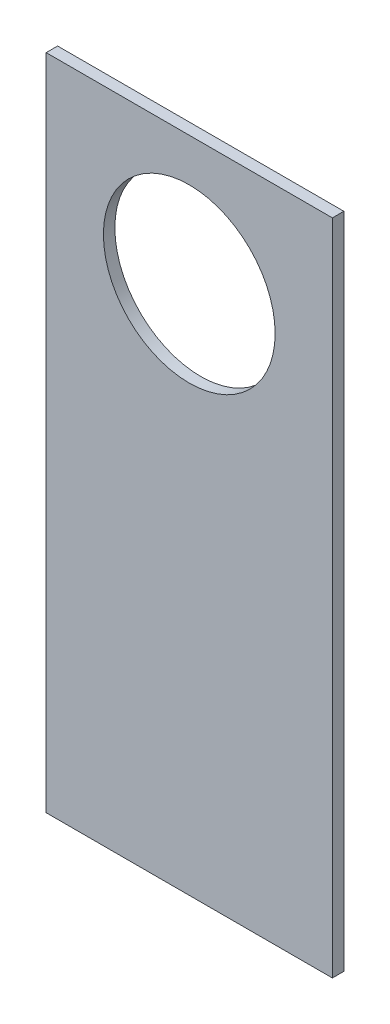
ISO-10303-21;
HEADER;
FILE_DESCRIPTION(('STEP AP214'),'2;1');
FILE_NAME('part.step','',(''),(''),'','','');
FILE_SCHEMA(('AUTOMOTIVE_DESIGN { 1 0 10303 214 1 1 1 1 }'));
ENDSEC;
DATA;
#1=APPLICATION_CONTEXT('core data for automotive mechanical design processes');
#2=APPLICATION_PROTOCOL_DEFINITION('international standard','automotive_design',2000,#1);
#3=PRODUCT_CONTEXT('',#1,'mechanical');
#4=PRODUCT('Part','Part','',(#3));
#5=PRODUCT_RELATED_PRODUCT_CATEGORY('part','',(#4));
#6=PRODUCT_DEFINITION_FORMATION('','',#4);
#7=PRODUCT_DEFINITION_CONTEXT('part definition',#1,'design');
#8=PRODUCT_DEFINITION('design','',#6,#7);
#9=PRODUCT_DEFINITION_SHAPE('','',#8);
#10=(LENGTH_UNIT() NAMED_UNIT(*) SI_UNIT(.MILLI.,.METRE.));
#11=(NAMED_UNIT(*) PLANE_ANGLE_UNIT() SI_UNIT($,.RADIAN.));
#12=(NAMED_UNIT(*) SI_UNIT($,.STERADIAN.) SOLID_ANGLE_UNIT());
#13=UNCERTAINTY_MEASURE_WITH_UNIT(LENGTH_MEASURE(1.E-05),#10,'distance_accuracy_value','');
#14=(GEOMETRIC_REPRESENTATION_CONTEXT(3) GLOBAL_UNCERTAINTY_ASSIGNED_CONTEXT((#13)) GLOBAL_UNIT_ASSIGNED_CONTEXT((#10,
#11,#12)) REPRESENTATION_CONTEXT('',''));
#15=CARTESIAN_POINT('',(0.,0.,0.));
#16=DIRECTION('',(0.,0.,1.));
#17=DIRECTION('',(1.,0.,0.));
#18=AXIS2_PLACEMENT_3D('',#15,#16,#17);
#19=CARTESIAN_POINT('',(-100.,460.,8.));
#20=DIRECTION('',(0.,-1.,0.));
#21=DIRECTION('',(0.,0.,-1.));
#22=AXIS2_PLACEMENT_3D('',#19,#20,#21);
#23=PLANE('',#22);
#24=DIRECTION('',(-1.,0.,0.));
#25=VECTOR('',#24,1.);
#26=CARTESIAN_POINT('',(-100.,460.,0.));
#27=LINE('',#26,#25);
#28=CARTESIAN_POINT('',(100.,460.,0.));
#29=VERTEX_POINT('',#28);
#30=CARTESIAN_POINT('',(-100.,460.,0.));
#31=VERTEX_POINT('',#30);
#32=EDGE_CURVE('E98',#29,#31,#27,.T.);
#33=ORIENTED_EDGE('',*,*,#32,.T.);
#34=DIRECTION('',(0.,0.,-1.));
#35=VECTOR('',#34,1.);
#36=CARTESIAN_POINT('',(-100.,460.,8.));
#37=LINE('',#36,#35);
#38=CARTESIAN_POINT('',(-100.,460.,8.));
#39=VERTEX_POINT('',#38);
#40=EDGE_CURVE('E11',#39,#31,#37,.T.);
#41=ORIENTED_EDGE('',*,*,#40,.F.);
#42=DIRECTION('',(-1.,0.,0.));
#43=VECTOR('',#42,1.);
#44=CARTESIAN_POINT('',(-100.,460.,8.));
#45=LINE('',#44,#43);
#46=CARTESIAN_POINT('',(100.,460.,8.));
#47=VERTEX_POINT('',#46);
#48=EDGE_CURVE('E86',#47,#39,#45,.T.);
#49=ORIENTED_EDGE('',*,*,#48,.F.);
#50=DIRECTION('',(0.,0.,-1.));
#51=VECTOR('',#50,1.);
#52=CARTESIAN_POINT('',(100.,460.,8.));
#53=LINE('',#52,#51);
#54=EDGE_CURVE('E94',#47,#29,#53,.T.);
#55=ORIENTED_EDGE('',*,*,#54,.T.);
#56=EDGE_LOOP('',(#33,#41,#49,#55));
#57=FACE_BOUND('',#56,.T.);
#58=ADVANCED_FACE('F35',(#57),#23,.F.);
#59=CARTESIAN_POINT('',(-100.,0.,8.));
#60=DIRECTION('',(1.,0.,0.));
#61=DIRECTION('',(0.,0.,-1.));
#62=AXIS2_PLACEMENT_3D('',#59,#60,#61);
#63=PLANE('',#62);
#64=DIRECTION('',(0.,-1.,0.));
#65=VECTOR('',#64,1.);
#66=CARTESIAN_POINT('',(-100.,0.,0.));
#67=LINE('',#66,#65);
#68=CARTESIAN_POINT('',(-100.,0.,0.));
#69=VERTEX_POINT('',#68);
#70=EDGE_CURVE('E90',#31,#69,#67,.T.);
#71=ORIENTED_EDGE('',*,*,#70,.T.);
#72=DIRECTION('',(0.,0.,-1.));
#73=VECTOR('',#72,1.);
#74=CARTESIAN_POINT('',(-100.,0.,8.));
#75=LINE('',#74,#73);
#76=CARTESIAN_POINT('',(-100.,0.,8.));
#77=VERTEX_POINT('',#76);
#78=EDGE_CURVE('E43',#77,#69,#75,.T.);
#79=ORIENTED_EDGE('',*,*,#78,.F.);
#80=DIRECTION('',(0.,-1.,0.));
#81=VECTOR('',#80,1.);
#82=CARTESIAN_POINT('',(-100.,0.,8.));
#83=LINE('',#82,#81);
#84=EDGE_CURVE('E81',#39,#77,#83,.T.);
#85=ORIENTED_EDGE('',*,*,#84,.F.);
#86=ORIENTED_EDGE('',*,*,#40,.T.);
#87=EDGE_LOOP('',(#71,#79,#85,#86));
#88=FACE_BOUND('',#87,.T.);
#89=ADVANCED_FACE('F89',(#88),#63,.F.);
#90=CARTESIAN_POINT('',(100.,0.,8.));
#91=DIRECTION('',(0.,1.,0.));
#92=DIRECTION('',(0.,0.,1.));
#93=AXIS2_PLACEMENT_3D('',#90,#91,#92);
#94=PLANE('',#93);
#95=DIRECTION('',(1.,0.,0.));
#96=VECTOR('',#95,1.);
#97=CARTESIAN_POINT('',(100.,0.,0.));
#98=LINE('',#97,#96);
#99=CARTESIAN_POINT('',(100.,0.,0.));
#100=VERTEX_POINT('',#99);
#101=EDGE_CURVE('E68',#69,#100,#98,.T.);
#102=ORIENTED_EDGE('',*,*,#101,.T.);
#103=DIRECTION('',(0.,0.,-1.));
#104=VECTOR('',#103,1.);
#105=CARTESIAN_POINT('',(100.,0.,8.));
#106=LINE('',#105,#104);
#107=CARTESIAN_POINT('',(100.,0.,8.));
#108=VERTEX_POINT('',#107);
#109=EDGE_CURVE('E91',#108,#100,#106,.T.);
#110=ORIENTED_EDGE('',*,*,#109,.F.);
#111=DIRECTION('',(1.,0.,0.));
#112=VECTOR('',#111,1.);
#113=CARTESIAN_POINT('',(100.,0.,8.));
#114=LINE('',#113,#112);
#115=EDGE_CURVE('E84',#77,#108,#114,.T.);
#116=ORIENTED_EDGE('',*,*,#115,.F.);
#117=ORIENTED_EDGE('',*,*,#78,.T.);
#118=EDGE_LOOP('',(#102,#110,#116,#117));
#119=FACE_BOUND('',#118,.T.);
#120=ADVANCED_FACE('F92',(#119),#94,.F.);
#121=CARTESIAN_POINT('',(100.,0.,8.));
#122=DIRECTION('',(-1.,0.,0.));
#123=DIRECTION('',(0.,0.,1.));
#124=AXIS2_PLACEMENT_3D('',#121,#122,#123);
#125=PLANE('',#124);
#126=DIRECTION('',(0.,1.,0.));
#127=VECTOR('',#126,1.);
#128=CARTESIAN_POINT('',(100.,0.,0.));
#129=LINE('',#128,#127);
#130=EDGE_CURVE('E74',#100,#29,#129,.T.);
#131=ORIENTED_EDGE('',*,*,#130,.T.);
#132=ORIENTED_EDGE('',*,*,#54,.F.);
#133=DIRECTION('',(0.,1.,0.));
#134=VECTOR('',#133,1.);
#135=CARTESIAN_POINT('',(100.,0.,8.));
#136=LINE('',#135,#134);
#137=EDGE_CURVE('E51',#108,#47,#136,.T.);
#138=ORIENTED_EDGE('',*,*,#137,.F.);
#139=ORIENTED_EDGE('',*,*,#109,.T.);
#140=EDGE_LOOP('',(#131,#132,#138,#139));
#141=FACE_BOUND('',#140,.T.);
#142=ADVANCED_FACE('F106',(#141),#125,.F.);
#143=CARTESIAN_POINT('',(0.,0.,8.));
#144=DIRECTION('',(0.,0.,1.));
#145=DIRECTION('',(1.,0.,0.));
#146=AXIS2_PLACEMENT_3D('',#143,#144,#145);
#147=PLANE('',#146);
#148=CARTESIAN_POINT('',(0.,370.,8.));
#149=DIRECTION('',(0.,0.,1.));
#150=DIRECTION('',(1.,0.,0.));
#151=AXIS2_PLACEMENT_3D('',#148,#149,#150);
#152=CIRCLE('',#151,60.);
#153=CARTESIAN_POINT('',(60.,370.,8.));
#154=VERTEX_POINT('',#153);
#155=EDGE_CURVE('E101',#154,#154,#152,.T.);
#156=ORIENTED_EDGE('',*,*,#155,.F.);
#157=EDGE_LOOP('',(#156));
#158=FACE_BOUND('',#157,.T.);
#159=ORIENTED_EDGE('',*,*,#48,.T.);
#160=ORIENTED_EDGE('',*,*,#84,.T.);
#161=ORIENTED_EDGE('',*,*,#115,.T.);
#162=ORIENTED_EDGE('',*,*,#137,.T.);
#163=EDGE_LOOP('',(#159,#160,#161,#162));
#164=FACE_BOUND('',#163,.T.);
#165=ADVANCED_FACE('F82',(#158,#164),#147,.T.);
#166=CARTESIAN_POINT('',(0.,0.,0.));
#167=DIRECTION('',(0.,0.,1.));
#168=DIRECTION('',(1.,0.,0.));
#169=AXIS2_PLACEMENT_3D('',#166,#167,#168);
#170=PLANE('',#169);
#171=CARTESIAN_POINT('',(0.,370.,0.));
#172=DIRECTION('',(0.,0.,-1.));
#173=DIRECTION('',(-1.,0.,0.));
#174=AXIS2_PLACEMENT_3D('',#171,#172,#173);
#175=CIRCLE('',#174,60.);
#176=CARTESIAN_POINT('',(-60.,370.,0.));
#177=VERTEX_POINT('',#176);
#178=EDGE_CURVE('E114',#177,#177,#175,.T.);
#179=ORIENTED_EDGE('',*,*,#178,.F.);
#180=EDGE_LOOP('',(#179));
#181=FACE_BOUND('',#180,.T.);
#182=ORIENTED_EDGE('',*,*,#32,.F.);
#183=ORIENTED_EDGE('',*,*,#130,.F.);
#184=ORIENTED_EDGE('',*,*,#101,.F.);
#185=ORIENTED_EDGE('',*,*,#70,.F.);
#186=EDGE_LOOP('',(#182,#183,#184,#185));
#187=FACE_BOUND('',#186,.T.);
#188=ADVANCED_FACE('F109',(#181,#187),#170,.F.);
#189=CARTESIAN_POINT('',(0.,370.,10.));
#190=DIRECTION('',(0.,0.,-1.));
#191=DIRECTION('',(-1.,0.,0.));
#192=AXIS2_PLACEMENT_3D('',#189,#190,#191);
#193=CYLINDRICAL_SURFACE('',#192,60.);
#194=ORIENTED_EDGE('',*,*,#155,.T.);
#195=EDGE_LOOP('',(#194));
#196=FACE_BOUND('',#195,.T.);
#197=ORIENTED_EDGE('',*,*,#178,.T.);
#198=EDGE_LOOP('',(#197));
#199=FACE_BOUND('',#198,.T.);
#200=ADVANCED_FACE('F118',(#196,#199),#193,.F.);
#201=CLOSED_SHELL('',(#58,#89,#120,#142,#165,#188,#200));
#202=MANIFOLD_SOLID_BREP('B2',#201);
#203=ADVANCED_BREP_SHAPE_REPRESENTATION('',(#18,#202),#14);
#204=SHAPE_DEFINITION_REPRESENTATION(#9,#203);
ENDSEC;
END-ISO-10303-21;
